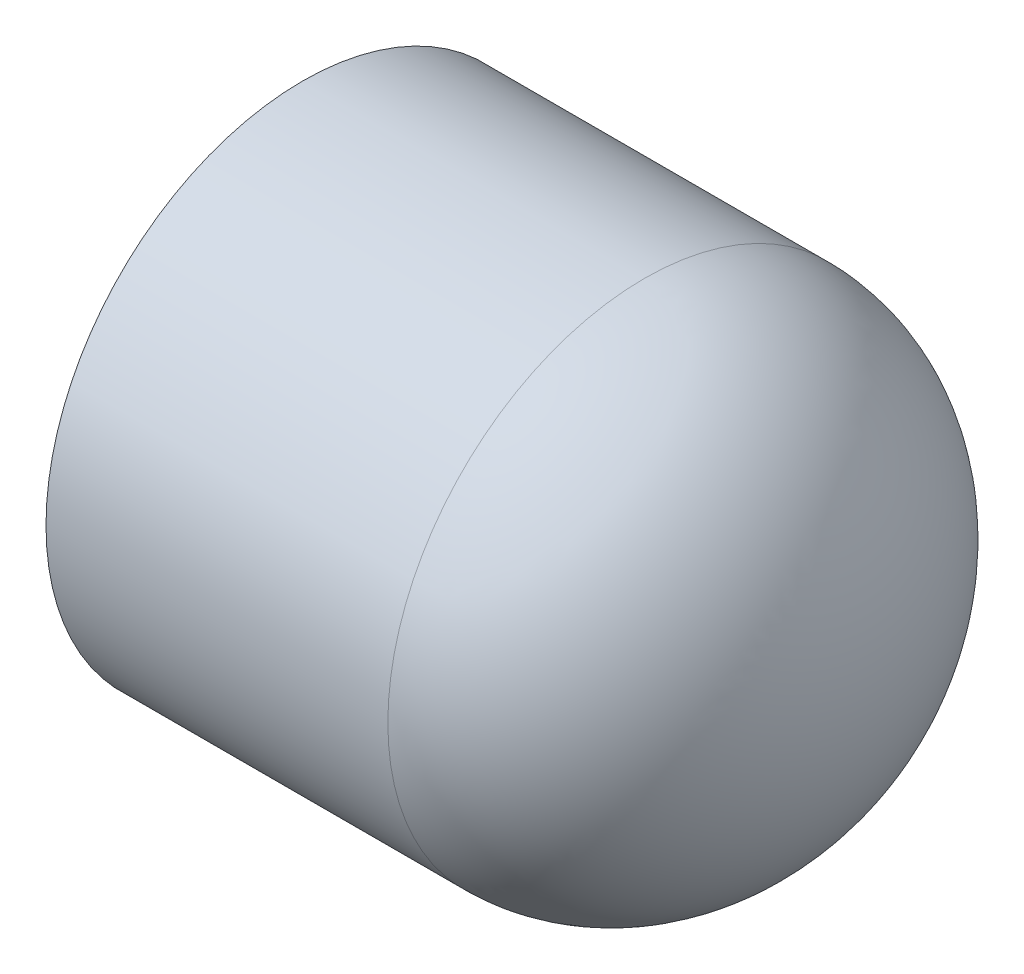
ISO-10303-21;
HEADER;
FILE_DESCRIPTION(('STEP AP214'),'2;1');
FILE_NAME('part.step','',(''),(''),'','','');
FILE_SCHEMA(('AUTOMOTIVE_DESIGN { 1 0 10303 214 1 1 1 1 }'));
ENDSEC;
DATA;
#1=APPLICATION_CONTEXT('core data for automotive mechanical design processes');
#2=APPLICATION_PROTOCOL_DEFINITION('international standard','automotive_design',2000,#1);
#3=PRODUCT_CONTEXT('',#1,'mechanical');
#4=PRODUCT('Part','Part','',(#3));
#5=PRODUCT_RELATED_PRODUCT_CATEGORY('part','',(#4));
#6=PRODUCT_DEFINITION_FORMATION('','',#4);
#7=PRODUCT_DEFINITION_CONTEXT('part definition',#1,'design');
#8=PRODUCT_DEFINITION('design','',#6,#7);
#9=PRODUCT_DEFINITION_SHAPE('','',#8);
#10=(LENGTH_UNIT() NAMED_UNIT(*) SI_UNIT(.MILLI.,.METRE.));
#11=(NAMED_UNIT(*) PLANE_ANGLE_UNIT() SI_UNIT($,.RADIAN.));
#12=(NAMED_UNIT(*) SI_UNIT($,.STERADIAN.) SOLID_ANGLE_UNIT());
#13=UNCERTAINTY_MEASURE_WITH_UNIT(LENGTH_MEASURE(1.E-05),#10,'distance_accuracy_value','');
#14=(GEOMETRIC_REPRESENTATION_CONTEXT(3) GLOBAL_UNCERTAINTY_ASSIGNED_CONTEXT((#13)) GLOBAL_UNIT_ASSIGNED_CONTEXT((#10,
#11,#12)) REPRESENTATION_CONTEXT('',''));
#15=CARTESIAN_POINT('',(0.,0.,0.));
#16=DIRECTION('',(0.,0.,1.));
#17=DIRECTION('',(1.,0.,0.));
#18=AXIS2_PLACEMENT_3D('',#15,#16,#17);
#19=CARTESIAN_POINT('',(-14.7193,0.,0.));
#20=DIRECTION('',(-1.,0.,0.));
#21=DIRECTION('',(0.,0.,1.));
#22=AXIS2_PLACEMENT_3D('',#19,#20,#21);
#23=CYLINDRICAL_SURFACE('',#22,13.6144);
#24=CARTESIAN_POINT('',(3.4163,0.,0.));
#25=DIRECTION('',(-1.,0.,0.));
#26=DIRECTION('',(0.,0.,1.));
#27=AXIS2_PLACEMENT_3D('',#24,#25,#26);
#28=CIRCLE('',#27,13.6144);
#29=CARTESIAN_POINT('',(3.4163,0.,13.6144));
#30=VERTEX_POINT('',#29);
#31=EDGE_CURVE('E11',#30,#30,#28,.T.);
#32=ORIENTED_EDGE('',*,*,#31,.T.);
#33=EDGE_LOOP('',(#32));
#34=FACE_BOUND('',#33,.T.);
#35=CARTESIAN_POINT('',(-14.7193,0.,0.));
#36=DIRECTION('',(-1.,0.,0.));
#37=DIRECTION('',(0.,0.,1.));
#38=AXIS2_PLACEMENT_3D('',#35,#36,#37);
#39=CIRCLE('',#38,13.6144);
#40=CARTESIAN_POINT('',(-14.7193,0.,13.6144));
#41=VERTEX_POINT('',#40);
#42=EDGE_CURVE('E53',#41,#41,#39,.T.);
#43=ORIENTED_EDGE('',*,*,#42,.F.);
#44=EDGE_LOOP('',(#43));
#45=FACE_BOUND('',#44,.T.);
#46=ADVANCED_FACE('F30',(#34,#45),#23,.T.);
#47=CARTESIAN_POINT('',(3.4163,0.,0.));
#48=DIRECTION('',(0.,0.,1.));
#49=DIRECTION('',(0.,1.,0.));
#50=AXIS2_PLACEMENT_3D('',#47,#48,#49);
#51=ELLIPSE('',#50,13.6144,11.303);
#52=TRIMMED_CURVE('',#51,(PARAMETER_VALUE(1.5707963267949)),(PARAMETER_VALUE(4.71238898038469)),
.T.,.PARAMETER.);
#53=CARTESIAN_POINT('',(-14.7193,0.,0.));
#54=DIRECTION('',(-1.,0.,0.));
#55=AXIS1_PLACEMENT('',#53,#54);
#56=SURFACE_OF_REVOLUTION('',#52,#55);
#57=CARTESIAN_POINT('',(14.7193,0.,0.));
#58=VERTEX_POINT('',#57);
#59=VERTEX_LOOP('',#58);
#60=FACE_BOUND('',#59,.T.);
#61=ORIENTED_EDGE('',*,*,#31,.F.);
#62=EDGE_LOOP('',(#61));
#63=FACE_BOUND('',#62,.T.);
#64=ADVANCED_FACE('F43',(#60,#63),#56,.F.);
#65=CARTESIAN_POINT('',(3.4163,0.,0.));
#66=DIRECTION('',(0.,0.,-1.));
#67=DIRECTION('',(0.,-1.,0.));
#68=AXIS2_PLACEMENT_3D('',#65,#66,#67);
#69=ELLIPSE('',#68,10.6172,8.30579999999999);
#70=TRIMMED_CURVE('',#69,(PARAMETER_VALUE(4.71238898038469)),
(PARAMETER_VALUE(7.85398163397448)),.T.,.PARAMETER.);
#71=CARTESIAN_POINT('',(-14.7193,0.,0.));
#72=DIRECTION('',(-1.,0.,0.));
#73=AXIS1_PLACEMENT('',#71,#72);
#74=SURFACE_OF_REVOLUTION('',#70,#73);
#75=CARTESIAN_POINT('',(3.4163,0.,0.));
#76=DIRECTION('',(-1.,0.,0.));
#77=DIRECTION('',(0.,0.,1.));
#78=AXIS2_PLACEMENT_3D('',#75,#76,#77);
#79=CIRCLE('',#78,10.6172);
#80=CARTESIAN_POINT('',(3.4163,0.,10.6172));
#81=VERTEX_POINT('',#80);
#82=EDGE_CURVE('E37',#81,#81,#79,.T.);
#83=ORIENTED_EDGE('',*,*,#82,.T.);
#84=EDGE_LOOP('',(#83));
#85=FACE_BOUND('',#84,.T.);
#86=CARTESIAN_POINT('',(11.7221,0.,0.));
#87=VERTEX_POINT('',#86);
#88=VERTEX_LOOP('',#87);
#89=FACE_BOUND('',#88,.T.);
#90=ADVANCED_FACE('F46',(#85,#89),#74,.F.);
#91=CARTESIAN_POINT('',(3.4163,0.,0.));
#92=DIRECTION('',(-1.,0.,0.));
#93=DIRECTION('',(0.,0.,1.));
#94=AXIS2_PLACEMENT_3D('',#91,#92,#93);
#95=CONICAL_SURFACE('',#94,10.6172,0.00840316354764701);
#96=CARTESIAN_POINT('',(-14.7193,0.,0.));
#97=DIRECTION('',(-1.,0.,0.));
#98=DIRECTION('',(0.,0.,1.));
#99=AXIS2_PLACEMENT_3D('',#96,#97,#98);
#100=CIRCLE('',#99,10.7696);
#101=CARTESIAN_POINT('',(-14.7193,0.,10.7696));
#102=VERTEX_POINT('',#101);
#103=EDGE_CURVE('E55',#102,#102,#100,.T.);
#104=ORIENTED_EDGE('',*,*,#103,.T.);
#105=EDGE_LOOP('',(#104));
#106=FACE_BOUND('',#105,.T.);
#107=ORIENTED_EDGE('',*,*,#82,.F.);
#108=EDGE_LOOP('',(#107));
#109=FACE_BOUND('',#108,.T.);
#110=ADVANCED_FACE('F66',(#106,#109),#95,.F.);
#111=CARTESIAN_POINT('',(-14.7193,-13.6144,0.));
#112=DIRECTION('',(-1.,0.,0.));
#113=DIRECTION('',(0.,0.,1.));
#114=AXIS2_PLACEMENT_3D('',#111,#112,#113);
#115=PLANE('',#114);
#116=ORIENTED_EDGE('',*,*,#42,.T.);
#117=EDGE_LOOP('',(#116));
#118=FACE_BOUND('',#117,.T.);
#119=ORIENTED_EDGE('',*,*,#103,.F.);
#120=EDGE_LOOP('',(#119));
#121=FACE_BOUND('',#120,.T.);
#122=ADVANCED_FACE('F68',(#118,#121),#115,.T.);
#123=CLOSED_SHELL('',(#46,#64,#90,#110,#122));
#124=MANIFOLD_SOLID_BREP('B2',#123);
#125=ADVANCED_BREP_SHAPE_REPRESENTATION('',(#18,#124),#14);
#126=SHAPE_DEFINITION_REPRESENTATION(#9,#125);
ENDSEC;
END-ISO-10303-21;
